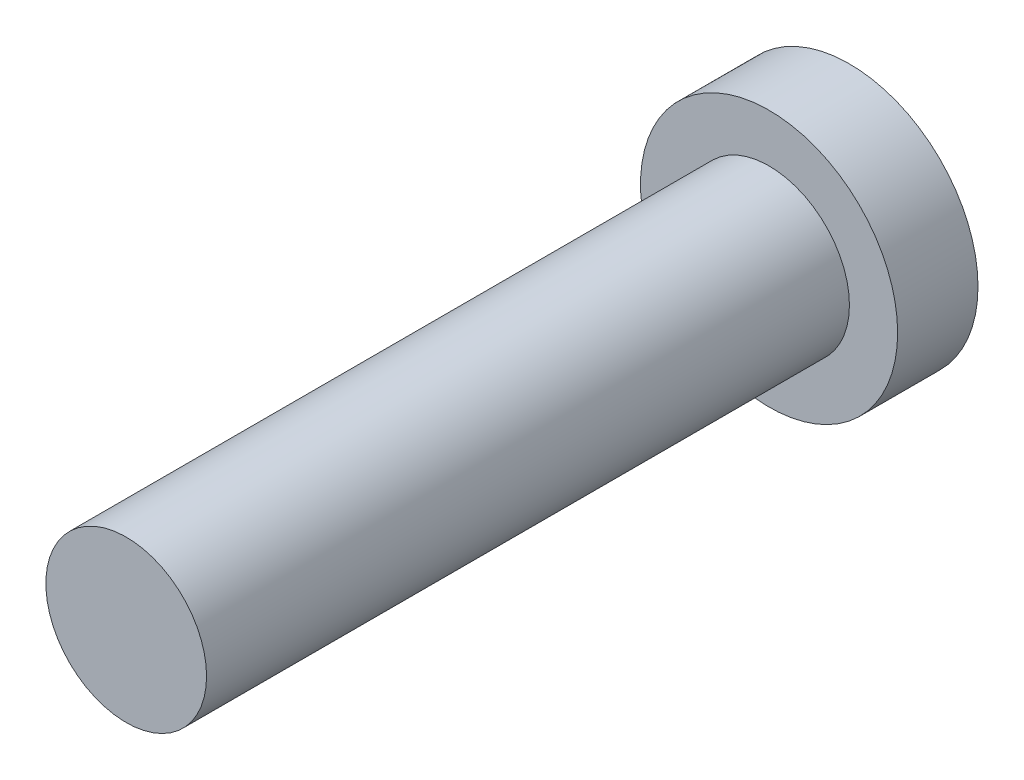
ISO-10303-21;
HEADER;
FILE_DESCRIPTION(('STEP AP214'),'2;1');
FILE_NAME('part.step','',(''),(''),'','','');
FILE_SCHEMA(('AUTOMOTIVE_DESIGN { 1 0 10303 214 1 1 1 1 }'));
ENDSEC;
DATA;
#1=APPLICATION_CONTEXT('core data for automotive mechanical design processes');
#2=APPLICATION_PROTOCOL_DEFINITION('international standard','automotive_design',2000,#1);
#3=PRODUCT_CONTEXT('',#1,'mechanical');
#4=PRODUCT('Part','Part','',(#3));
#5=PRODUCT_RELATED_PRODUCT_CATEGORY('part','',(#4));
#6=PRODUCT_DEFINITION_FORMATION('','',#4);
#7=PRODUCT_DEFINITION_CONTEXT('part definition',#1,'design');
#8=PRODUCT_DEFINITION('design','',#6,#7);
#9=PRODUCT_DEFINITION_SHAPE('','',#8);
#10=(LENGTH_UNIT() NAMED_UNIT(*) SI_UNIT(.MILLI.,.METRE.));
#11=(NAMED_UNIT(*) PLANE_ANGLE_UNIT() SI_UNIT($,.RADIAN.));
#12=(NAMED_UNIT(*) SI_UNIT($,.STERADIAN.) SOLID_ANGLE_UNIT());
#13=UNCERTAINTY_MEASURE_WITH_UNIT(LENGTH_MEASURE(1.E-05),#10,'distance_accuracy_value','');
#14=(GEOMETRIC_REPRESENTATION_CONTEXT(3) GLOBAL_UNCERTAINTY_ASSIGNED_CONTEXT((#13)) GLOBAL_UNIT_ASSIGNED_CONTEXT((#10,
#11,#12)) REPRESENTATION_CONTEXT('',''));
#15=CARTESIAN_POINT('',(0.,0.,0.));
#16=DIRECTION('',(0.,0.,1.));
#17=DIRECTION('',(1.,0.,0.));
#18=AXIS2_PLACEMENT_3D('',#15,#16,#17);
#19=CARTESIAN_POINT('',(0.,0.,5.));
#20=DIRECTION('',(0.,0.,-1.));
#21=DIRECTION('',(-1.,0.,0.));
#22=AXIS2_PLACEMENT_3D('',#19,#20,#21);
#23=CYLINDRICAL_SURFACE('',#22,8.);
#24=CARTESIAN_POINT('',(0.,0.,5.));
#25=DIRECTION('',(0.,0.,1.));
#26=DIRECTION('',(1.,0.,0.));
#27=AXIS2_PLACEMENT_3D('',#24,#25,#26);
#28=CIRCLE('',#27,8.);
#29=CARTESIAN_POINT('',(8.,0.,5.));
#30=VERTEX_POINT('',#29);
#31=EDGE_CURVE('E47',#30,#30,#28,.T.);
#32=ORIENTED_EDGE('',*,*,#31,.F.);
#33=EDGE_LOOP('',(#32));
#34=FACE_BOUND('',#33,.T.);
#35=CARTESIAN_POINT('',(0.,0.,0.));
#36=DIRECTION('',(0.,0.,1.));
#37=DIRECTION('',(1.,0.,0.));
#38=AXIS2_PLACEMENT_3D('',#35,#36,#37);
#39=CIRCLE('',#38,8.);
#40=CARTESIAN_POINT('',(8.,0.,0.));
#41=VERTEX_POINT('',#40);
#42=EDGE_CURVE('E42',#41,#41,#39,.T.);
#43=ORIENTED_EDGE('',*,*,#42,.T.);
#44=EDGE_LOOP('',(#43));
#45=FACE_BOUND('',#44,.T.);
#46=ADVANCED_FACE('F39',(#34,#45),#23,.T.);
#47=CARTESIAN_POINT('',(0.,0.,5.));
#48=DIRECTION('',(0.,0.,1.));
#49=DIRECTION('',(1.,0.,0.));
#50=AXIS2_PLACEMENT_3D('',#47,#48,#49);
#51=PLANE('',#50);
#52=CARTESIAN_POINT('',(0.,0.,5.));
#53=DIRECTION('',(0.,0.,1.));
#54=DIRECTION('',(1.,0.,0.));
#55=AXIS2_PLACEMENT_3D('',#52,#53,#54);
#56=CIRCLE('',#55,5.);
#57=CARTESIAN_POINT('',(5.,0.,5.));
#58=VERTEX_POINT('',#57);
#59=EDGE_CURVE('E10',#58,#58,#56,.T.);
#60=ORIENTED_EDGE('',*,*,#59,.F.);
#61=EDGE_LOOP('',(#60));
#62=FACE_BOUND('',#61,.T.);
#63=ORIENTED_EDGE('',*,*,#31,.T.);
#64=EDGE_LOOP('',(#63));
#65=FACE_BOUND('',#64,.T.);
#66=ADVANCED_FACE('F67',(#62,#65),#51,.T.);
#67=CARTESIAN_POINT('',(0.,0.,0.));
#68=DIRECTION('',(0.,0.,1.));
#69=DIRECTION('',(1.,0.,0.));
#70=AXIS2_PLACEMENT_3D('',#67,#68,#69);
#71=PLANE('',#70);
#72=ORIENTED_EDGE('',*,*,#42,.F.);
#73=EDGE_LOOP('',(#72));
#74=FACE_BOUND('',#73,.T.);
#75=ADVANCED_FACE('F64',(#74),#71,.F.);
#76=CARTESIAN_POINT('',(0.,0.,45.));
#77=DIRECTION('',(0.,0.,-1.));
#78=DIRECTION('',(-1.,0.,0.));
#79=AXIS2_PLACEMENT_3D('',#76,#77,#78);
#80=CYLINDRICAL_SURFACE('',#79,5.);
#81=CARTESIAN_POINT('',(0.,0.,45.));
#82=DIRECTION('',(0.,0.,1.));
#83=DIRECTION('',(1.,0.,0.));
#84=AXIS2_PLACEMENT_3D('',#81,#82,#83);
#85=CIRCLE('',#84,5.);
#86=CARTESIAN_POINT('',(5.,0.,45.));
#87=VERTEX_POINT('',#86);
#88=EDGE_CURVE('E54',#87,#87,#85,.T.);
#89=ORIENTED_EDGE('',*,*,#88,.F.);
#90=EDGE_LOOP('',(#89));
#91=FACE_BOUND('',#90,.T.);
#92=ORIENTED_EDGE('',*,*,#59,.T.);
#93=EDGE_LOOP('',(#92));
#94=FACE_BOUND('',#93,.T.);
#95=ADVANCED_FACE('F66',(#91,#94),#80,.T.);
#96=CARTESIAN_POINT('',(0.,0.,45.));
#97=DIRECTION('',(0.,0.,1.));
#98=DIRECTION('',(1.,0.,0.));
#99=AXIS2_PLACEMENT_3D('',#96,#97,#98);
#100=PLANE('',#99);
#101=ORIENTED_EDGE('',*,*,#88,.T.);
#102=EDGE_LOOP('',(#101));
#103=FACE_BOUND('',#102,.T.);
#104=ADVANCED_FACE('F72',(#103),#100,.T.);
#105=CLOSED_SHELL('',(#46,#66,#75,#95,#104));
#106=MANIFOLD_SOLID_BREP('B2',#105);
#107=ADVANCED_BREP_SHAPE_REPRESENTATION('',(#18,#106),#14);
#108=SHAPE_DEFINITION_REPRESENTATION(#9,#107);
ENDSEC;
END-ISO-10303-21;
